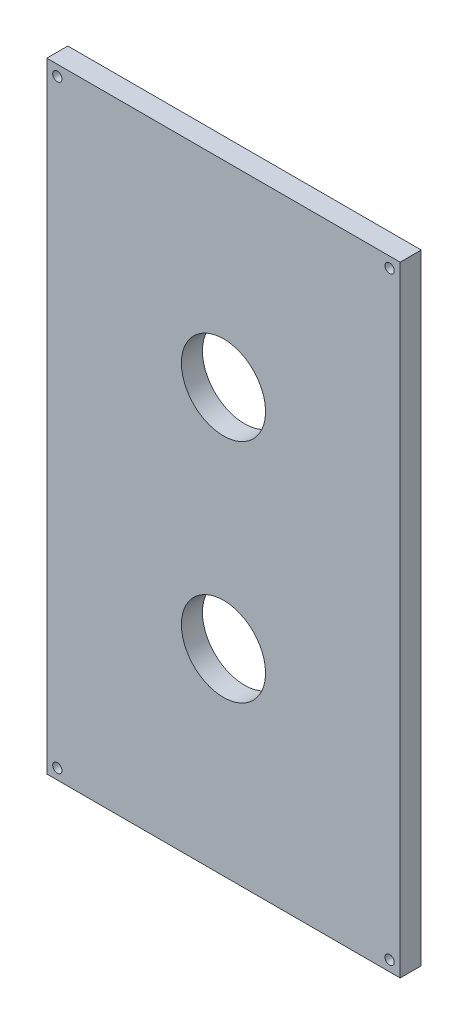
ISO-10303-21;
HEADER;
FILE_DESCRIPTION(('STEP AP214'),'2;1');
FILE_NAME('part.step','',(''),(''),'','','');
FILE_SCHEMA(('AUTOMOTIVE_DESIGN { 1 0 10303 214 1 1 1 1 }'));
ENDSEC;
DATA;
#1=APPLICATION_CONTEXT('core data for automotive mechanical design processes');
#2=APPLICATION_PROTOCOL_DEFINITION('international standard','automotive_design',2000,#1);
#3=PRODUCT_CONTEXT('',#1,'mechanical');
#4=PRODUCT('Part','Part','',(#3));
#5=PRODUCT_RELATED_PRODUCT_CATEGORY('part','',(#4));
#6=PRODUCT_DEFINITION_FORMATION('','',#4);
#7=PRODUCT_DEFINITION_CONTEXT('part definition',#1,'design');
#8=PRODUCT_DEFINITION('design','',#6,#7);
#9=PRODUCT_DEFINITION_SHAPE('','',#8);
#10=(LENGTH_UNIT() NAMED_UNIT(*) SI_UNIT(.MILLI.,.METRE.));
#11=(NAMED_UNIT(*) PLANE_ANGLE_UNIT() SI_UNIT($,.RADIAN.));
#12=(NAMED_UNIT(*) SI_UNIT($,.STERADIAN.) SOLID_ANGLE_UNIT());
#13=UNCERTAINTY_MEASURE_WITH_UNIT(LENGTH_MEASURE(1.E-05),#10,'distance_accuracy_value','');
#14=(GEOMETRIC_REPRESENTATION_CONTEXT(3) GLOBAL_UNCERTAINTY_ASSIGNED_CONTEXT((#13)) GLOBAL_UNIT_ASSIGNED_CONTEXT((#10,
#11,#12)) REPRESENTATION_CONTEXT('',''));
#15=CARTESIAN_POINT('',(0.,0.,0.));
#16=DIRECTION('',(0.,0.,1.));
#17=DIRECTION('',(1.,0.,0.));
#18=AXIS2_PLACEMENT_3D('',#15,#16,#17);
#19=CARTESIAN_POINT('',(0.,147.35,5.));
#20=DIRECTION('',(-1.,0.,0.));
#21=DIRECTION('',(0.,0.,1.));
#22=AXIS2_PLACEMENT_3D('',#19,#20,#21);
#23=PLANE('',#22);
#24=DIRECTION('',(0.,1.,0.));
#25=VECTOR('',#24,1.);
#26=CARTESIAN_POINT('',(0.,147.35,0.));
#27=LINE('',#26,#25);
#28=CARTESIAN_POINT('',(0.,0.,0.));
#29=VERTEX_POINT('',#28);
#30=CARTESIAN_POINT('',(0.,147.35,0.));
#31=VERTEX_POINT('',#30);
#32=EDGE_CURVE('E96',#29,#31,#27,.T.);
#33=ORIENTED_EDGE('',*,*,#32,.T.);
#34=DIRECTION('',(0.,0.,-1.));
#35=VECTOR('',#34,1.);
#36=CARTESIAN_POINT('',(0.,147.35,5.));
#37=LINE('',#36,#35);
#38=CARTESIAN_POINT('',(0.,147.35,5.));
#39=VERTEX_POINT('',#38);
#40=EDGE_CURVE('E11',#39,#31,#37,.T.);
#41=ORIENTED_EDGE('',*,*,#40,.F.);
#42=DIRECTION('',(0.,1.,0.));
#43=VECTOR('',#42,1.);
#44=CARTESIAN_POINT('',(0.,147.35,5.));
#45=LINE('',#44,#43);
#46=CARTESIAN_POINT('',(0.,0.,5.));
#47=VERTEX_POINT('',#46);
#48=EDGE_CURVE('E84',#47,#39,#45,.T.);
#49=ORIENTED_EDGE('',*,*,#48,.F.);
#50=DIRECTION('',(0.,0.,-1.));
#51=VECTOR('',#50,1.);
#52=CARTESIAN_POINT('',(0.,0.,5.));
#53=LINE('',#52,#51);
#54=EDGE_CURVE('E92',#47,#29,#53,.T.);
#55=ORIENTED_EDGE('',*,*,#54,.T.);
#56=EDGE_LOOP('',(#33,#41,#49,#55));
#57=FACE_BOUND('',#56,.T.);
#58=ADVANCED_FACE('F33',(#57),#23,.F.);
#59=CARTESIAN_POINT('',(-83.98,147.35,5.));
#60=DIRECTION('',(0.,-1.,0.));
#61=DIRECTION('',(0.,0.,-1.));
#62=AXIS2_PLACEMENT_3D('',#59,#60,#61);
#63=PLANE('',#62);
#64=DIRECTION('',(-1.,0.,0.));
#65=VECTOR('',#64,1.);
#66=CARTESIAN_POINT('',(-83.98,147.35,0.));
#67=LINE('',#66,#65);
#68=CARTESIAN_POINT('',(-83.98,147.35,0.));
#69=VERTEX_POINT('',#68);
#70=EDGE_CURVE('E88',#31,#69,#67,.T.);
#71=ORIENTED_EDGE('',*,*,#70,.T.);
#72=DIRECTION('',(0.,0.,-1.));
#73=VECTOR('',#72,1.);
#74=CARTESIAN_POINT('',(-83.98,147.35,5.));
#75=LINE('',#74,#73);
#76=CARTESIAN_POINT('',(-83.98,147.35,5.));
#77=VERTEX_POINT('',#76);
#78=EDGE_CURVE('E41',#77,#69,#75,.T.);
#79=ORIENTED_EDGE('',*,*,#78,.F.);
#80=DIRECTION('',(-1.,0.,0.));
#81=VECTOR('',#80,1.);
#82=CARTESIAN_POINT('',(-83.98,147.35,5.));
#83=LINE('',#82,#81);
#84=EDGE_CURVE('E79',#39,#77,#83,.T.);
#85=ORIENTED_EDGE('',*,*,#84,.F.);
#86=ORIENTED_EDGE('',*,*,#40,.T.);
#87=EDGE_LOOP('',(#71,#79,#85,#86));
#88=FACE_BOUND('',#87,.T.);
#89=ADVANCED_FACE('F87',(#88),#63,.F.);
#90=CARTESIAN_POINT('',(-83.98,0.,5.));
#91=DIRECTION('',(1.,0.,0.));
#92=DIRECTION('',(0.,0.,-1.));
#93=AXIS2_PLACEMENT_3D('',#90,#91,#92);
#94=PLANE('',#93);
#95=DIRECTION('',(0.,-1.,0.));
#96=VECTOR('',#95,1.);
#97=CARTESIAN_POINT('',(-83.98,0.,0.));
#98=LINE('',#97,#96);
#99=CARTESIAN_POINT('',(-83.98,0.,0.));
#100=VERTEX_POINT('',#99);
#101=EDGE_CURVE('E66',#69,#100,#98,.T.);
#102=ORIENTED_EDGE('',*,*,#101,.T.);
#103=DIRECTION('',(0.,0.,-1.));
#104=VECTOR('',#103,1.);
#105=CARTESIAN_POINT('',(-83.98,0.,5.));
#106=LINE('',#105,#104);
#107=CARTESIAN_POINT('',(-83.98,0.,5.));
#108=VERTEX_POINT('',#107);
#109=EDGE_CURVE('E89',#108,#100,#106,.T.);
#110=ORIENTED_EDGE('',*,*,#109,.F.);
#111=DIRECTION('',(0.,-1.,0.));
#112=VECTOR('',#111,1.);
#113=CARTESIAN_POINT('',(-83.98,0.,5.));
#114=LINE('',#113,#112);
#115=EDGE_CURVE('E82',#77,#108,#114,.T.);
#116=ORIENTED_EDGE('',*,*,#115,.F.);
#117=ORIENTED_EDGE('',*,*,#78,.T.);
#118=EDGE_LOOP('',(#102,#110,#116,#117));
#119=FACE_BOUND('',#118,.T.);
#120=ADVANCED_FACE('F90',(#119),#94,.F.);
#121=CARTESIAN_POINT('',(0.,0.,5.));
#122=DIRECTION('',(0.,1.,0.));
#123=DIRECTION('',(-1.,0.,0.));
#124=AXIS2_PLACEMENT_3D('',#121,#122,#123);
#125=PLANE('',#124);
#126=DIRECTION('',(1.,0.,0.));
#127=VECTOR('',#126,1.);
#128=CARTESIAN_POINT('',(0.,0.,0.));
#129=LINE('',#128,#127);
#130=EDGE_CURVE('E72',#100,#29,#129,.T.);
#131=ORIENTED_EDGE('',*,*,#130,.T.);
#132=ORIENTED_EDGE('',*,*,#54,.F.);
#133=DIRECTION('',(1.,0.,0.));
#134=VECTOR('',#133,1.);
#135=CARTESIAN_POINT('',(0.,0.,5.));
#136=LINE('',#135,#134);
#137=EDGE_CURVE('E49',#108,#47,#136,.T.);
#138=ORIENTED_EDGE('',*,*,#137,.F.);
#139=ORIENTED_EDGE('',*,*,#109,.T.);
#140=EDGE_LOOP('',(#131,#132,#138,#139));
#141=FACE_BOUND('',#140,.T.);
#142=ADVANCED_FACE('F104',(#141),#125,.F.);
#143=CARTESIAN_POINT('',(0.,0.,5.));
#144=DIRECTION('',(0.,0.,-1.));
#145=DIRECTION('',(-1.,0.,0.));
#146=AXIS2_PLACEMENT_3D('',#143,#144,#145);
#147=PLANE('',#146);
#148=CARTESIAN_POINT('',(-2.5,2.49999999999999,5.));
#149=DIRECTION('',(0.,0.,-1.));
#150=DIRECTION('',(-1.,0.,0.));
#151=AXIS2_PLACEMENT_3D('',#148,#149,#150);
#152=CIRCLE('',#151,1.1);
#153=CARTESIAN_POINT('',(-3.6,2.49999999999999,5.));
#154=VERTEX_POINT('',#153);
#155=EDGE_CURVE('E131',#154,#154,#152,.T.);
#156=ORIENTED_EDGE('',*,*,#155,.T.);
#157=EDGE_LOOP('',(#156));
#158=FACE_BOUND('',#157,.T.);
#159=CARTESIAN_POINT('',(-81.48,2.49999999999999,5.));
#160=DIRECTION('',(0.,0.,-1.));
#161=DIRECTION('',(-1.,0.,0.));
#162=AXIS2_PLACEMENT_3D('',#159,#160,#161);
#163=CIRCLE('',#162,1.10000000000001);
#164=CARTESIAN_POINT('',(-82.58,2.49999999999999,5.));
#165=VERTEX_POINT('',#164);
#166=EDGE_CURVE('E137',#165,#165,#163,.T.);
#167=ORIENTED_EDGE('',*,*,#166,.T.);
#168=EDGE_LOOP('',(#167));
#169=FACE_BOUND('',#168,.T.);
#170=CARTESIAN_POINT('',(-81.48,144.85,5.));
#171=DIRECTION('',(0.,0.,-1.));
#172=DIRECTION('',(-1.,0.,0.));
#173=AXIS2_PLACEMENT_3D('',#170,#171,#172);
#174=CIRCLE('',#173,1.1);
#175=CARTESIAN_POINT('',(-82.58,144.85,5.));
#176=VERTEX_POINT('',#175);
#177=EDGE_CURVE('E125',#176,#176,#174,.T.);
#178=ORIENTED_EDGE('',*,*,#177,.T.);
#179=EDGE_LOOP('',(#178));
#180=FACE_BOUND('',#179,.T.);
#181=CARTESIAN_POINT('',(-2.5,144.85,5.));
#182=DIRECTION('',(0.,0.,-1.));
#183=DIRECTION('',(-1.,0.,0.));
#184=AXIS2_PLACEMENT_3D('',#181,#182,#183);
#185=CIRCLE('',#184,1.09999999999999);
#186=CARTESIAN_POINT('',(-3.59999999999999,144.85,5.));
#187=VERTEX_POINT('',#186);
#188=EDGE_CURVE('E114',#187,#187,#185,.T.);
#189=ORIENTED_EDGE('',*,*,#188,.T.);
#190=EDGE_LOOP('',(#189));
#191=FACE_BOUND('',#190,.T.);
#192=CARTESIAN_POINT('',(-41.99,100.585,5.));
#193=DIRECTION('',(0.,0.,-1.));
#194=DIRECTION('',(-1.,0.,0.));
#195=AXIS2_PLACEMENT_3D('',#192,#193,#194);
#196=CIRCLE('',#195,10.);
#197=CARTESIAN_POINT('',(-51.99,100.585,5.));
#198=VERTEX_POINT('',#197);
#199=EDGE_CURVE('E99',#198,#198,#196,.T.);
#200=ORIENTED_EDGE('',*,*,#199,.T.);
#201=EDGE_LOOP('',(#200));
#202=FACE_BOUND('',#201,.T.);
#203=CARTESIAN_POINT('',(-41.99,46.765,5.));
#204=DIRECTION('',(0.,0.,-1.));
#205=DIRECTION('',(-1.,0.,0.));
#206=AXIS2_PLACEMENT_3D('',#203,#204,#205);
#207=CIRCLE('',#206,10.);
#208=CARTESIAN_POINT('',(-51.99,46.765,5.));
#209=VERTEX_POINT('',#208);
#210=EDGE_CURVE('E113',#209,#209,#207,.T.);
#211=ORIENTED_EDGE('',*,*,#210,.T.);
#212=EDGE_LOOP('',(#211));
#213=FACE_BOUND('',#212,.T.);
#214=ORIENTED_EDGE('',*,*,#48,.T.);
#215=ORIENTED_EDGE('',*,*,#84,.T.);
#216=ORIENTED_EDGE('',*,*,#115,.T.);
#217=ORIENTED_EDGE('',*,*,#137,.T.);
#218=EDGE_LOOP('',(#214,#215,#216,#217));
#219=FACE_BOUND('',#218,.T.);
#220=ADVANCED_FACE('F80',(#158,#169,#180,#191,#202,#213,#219),#147,.F.);
#221=CARTESIAN_POINT('',(0.,0.,0.));
#222=DIRECTION('',(0.,0.,-1.));
#223=DIRECTION('',(-1.,0.,0.));
#224=AXIS2_PLACEMENT_3D('',#221,#222,#223);
#225=PLANE('',#224);
#226=CARTESIAN_POINT('',(-2.5,2.49999999999999,0.));
#227=DIRECTION('',(0.,0.,-1.));
#228=DIRECTION('',(-1.,0.,0.));
#229=AXIS2_PLACEMENT_3D('',#226,#227,#228);
#230=CIRCLE('',#229,1.1);
#231=CARTESIAN_POINT('',(-3.6,2.49999999999999,0.));
#232=VERTEX_POINT('',#231);
#233=EDGE_CURVE('E128',#232,#232,#230,.T.);
#234=ORIENTED_EDGE('',*,*,#233,.F.);
#235=EDGE_LOOP('',(#234));
#236=FACE_BOUND('',#235,.T.);
#237=CARTESIAN_POINT('',(-81.48,2.49999999999999,0.));
#238=DIRECTION('',(0.,0.,-1.));
#239=DIRECTION('',(-1.,0.,0.));
#240=AXIS2_PLACEMENT_3D('',#237,#238,#239);
#241=CIRCLE('',#240,1.10000000000001);
#242=CARTESIAN_POINT('',(-82.58,2.49999999999999,0.));
#243=VERTEX_POINT('',#242);
#244=EDGE_CURVE('E134',#243,#243,#241,.T.);
#245=ORIENTED_EDGE('',*,*,#244,.F.);
#246=EDGE_LOOP('',(#245));
#247=FACE_BOUND('',#246,.T.);
#248=CARTESIAN_POINT('',(-81.48,144.85,0.));
#249=DIRECTION('',(0.,0.,-1.));
#250=DIRECTION('',(-1.,0.,0.));
#251=AXIS2_PLACEMENT_3D('',#248,#249,#250);
#252=CIRCLE('',#251,1.1);
#253=CARTESIAN_POINT('',(-82.58,144.85,0.));
#254=VERTEX_POINT('',#253);
#255=EDGE_CURVE('E140',#254,#254,#252,.T.);
#256=ORIENTED_EDGE('',*,*,#255,.F.);
#257=EDGE_LOOP('',(#256));
#258=FACE_BOUND('',#257,.T.);
#259=CARTESIAN_POINT('',(-2.5,144.85,0.));
#260=DIRECTION('',(0.,0.,-1.));
#261=DIRECTION('',(-1.,0.,0.));
#262=AXIS2_PLACEMENT_3D('',#259,#260,#261);
#263=CIRCLE('',#262,1.09999999999999);
#264=CARTESIAN_POINT('',(-3.59999999999999,144.85,0.));
#265=VERTEX_POINT('',#264);
#266=EDGE_CURVE('E122',#265,#265,#263,.T.);
#267=ORIENTED_EDGE('',*,*,#266,.F.);
#268=EDGE_LOOP('',(#267));
#269=FACE_BOUND('',#268,.T.);
#270=CARTESIAN_POINT('',(-41.99,100.585,0.));
#271=DIRECTION('',(0.,0.,-1.));
#272=DIRECTION('',(-1.,0.,0.));
#273=AXIS2_PLACEMENT_3D('',#270,#271,#272);
#274=CIRCLE('',#273,10.);
#275=CARTESIAN_POINT('',(-51.99,100.585,0.));
#276=VERTEX_POINT('',#275);
#277=EDGE_CURVE('E117',#276,#276,#274,.T.);
#278=ORIENTED_EDGE('',*,*,#277,.F.);
#279=EDGE_LOOP('',(#278));
#280=FACE_BOUND('',#279,.T.);
#281=CARTESIAN_POINT('',(-41.99,46.765,0.));
#282=DIRECTION('',(0.,0.,-1.));
#283=DIRECTION('',(-1.,0.,0.));
#284=AXIS2_PLACEMENT_3D('',#281,#282,#283);
#285=CIRCLE('',#284,10.);
#286=CARTESIAN_POINT('',(-51.99,46.765,0.));
#287=VERTEX_POINT('',#286);
#288=EDGE_CURVE('E110',#287,#287,#285,.T.);
#289=ORIENTED_EDGE('',*,*,#288,.F.);
#290=EDGE_LOOP('',(#289));
#291=FACE_BOUND('',#290,.T.);
#292=ORIENTED_EDGE('',*,*,#32,.F.);
#293=ORIENTED_EDGE('',*,*,#130,.F.);
#294=ORIENTED_EDGE('',*,*,#101,.F.);
#295=ORIENTED_EDGE('',*,*,#70,.F.);
#296=EDGE_LOOP('',(#292,#293,#294,#295));
#297=FACE_BOUND('',#296,.T.);
#298=ADVANCED_FACE('F107',(#236,#247,#258,#269,#280,#291,#297),#225,.T.);
#299=CARTESIAN_POINT('',(-41.99,46.765,5.));
#300=DIRECTION('',(0.,0.,-1.));
#301=DIRECTION('',(-1.,0.,0.));
#302=AXIS2_PLACEMENT_3D('',#299,#300,#301);
#303=CYLINDRICAL_SURFACE('',#302,10.);
#304=ORIENTED_EDGE('',*,*,#210,.F.);
#305=EDGE_LOOP('',(#304));
#306=FACE_BOUND('',#305,.T.);
#307=ORIENTED_EDGE('',*,*,#288,.T.);
#308=EDGE_LOOP('',(#307));
#309=FACE_BOUND('',#308,.T.);
#310=ADVANCED_FACE('F158',(#306,#309),#303,.F.);
#311=CARTESIAN_POINT('',(-41.99,100.585,5.));
#312=DIRECTION('',(0.,0.,-1.));
#313=DIRECTION('',(-1.,0.,0.));
#314=AXIS2_PLACEMENT_3D('',#311,#312,#313);
#315=CYLINDRICAL_SURFACE('',#314,10.);
#316=ORIENTED_EDGE('',*,*,#199,.F.);
#317=EDGE_LOOP('',(#316));
#318=FACE_BOUND('',#317,.T.);
#319=ORIENTED_EDGE('',*,*,#277,.T.);
#320=EDGE_LOOP('',(#319));
#321=FACE_BOUND('',#320,.T.);
#322=ADVANCED_FACE('F168',(#318,#321),#315,.F.);
#323=CARTESIAN_POINT('',(-2.5,144.85,5.));
#324=DIRECTION('',(0.,0.,-1.));
#325=DIRECTION('',(-1.,0.,0.));
#326=AXIS2_PLACEMENT_3D('',#323,#324,#325);
#327=CYLINDRICAL_SURFACE('',#326,1.09999999999999);
#328=ORIENTED_EDGE('',*,*,#188,.F.);
#329=EDGE_LOOP('',(#328));
#330=FACE_BOUND('',#329,.T.);
#331=ORIENTED_EDGE('',*,*,#266,.T.);
#332=EDGE_LOOP('',(#331));
#333=FACE_BOUND('',#332,.T.);
#334=ADVANCED_FACE('F152',(#330,#333),#327,.F.);
#335=CARTESIAN_POINT('',(-81.48,144.85,5.));
#336=DIRECTION('',(0.,0.,-1.));
#337=DIRECTION('',(-1.,0.,0.));
#338=AXIS2_PLACEMENT_3D('',#335,#336,#337);
#339=CYLINDRICAL_SURFACE('',#338,1.1);
#340=ORIENTED_EDGE('',*,*,#177,.F.);
#341=EDGE_LOOP('',(#340));
#342=FACE_BOUND('',#341,.T.);
#343=ORIENTED_EDGE('',*,*,#255,.T.);
#344=EDGE_LOOP('',(#343));
#345=FACE_BOUND('',#344,.T.);
#346=ADVANCED_FACE('F148',(#342,#345),#339,.F.);
#347=CARTESIAN_POINT('',(-81.48,2.49999999999999,5.));
#348=DIRECTION('',(0.,0.,-1.));
#349=DIRECTION('',(-1.,0.,0.));
#350=AXIS2_PLACEMENT_3D('',#347,#348,#349);
#351=CYLINDRICAL_SURFACE('',#350,1.10000000000001);
#352=ORIENTED_EDGE('',*,*,#166,.F.);
#353=EDGE_LOOP('',(#352));
#354=FACE_BOUND('',#353,.T.);
#355=ORIENTED_EDGE('',*,*,#244,.T.);
#356=EDGE_LOOP('',(#355));
#357=FACE_BOUND('',#356,.T.);
#358=ADVANCED_FACE('F151',(#354,#357),#351,.F.);
#359=CARTESIAN_POINT('',(-2.5,2.49999999999999,5.));
#360=DIRECTION('',(0.,0.,-1.));
#361=DIRECTION('',(-1.,0.,0.));
#362=AXIS2_PLACEMENT_3D('',#359,#360,#361);
#363=CYLINDRICAL_SURFACE('',#362,1.1);
#364=ORIENTED_EDGE('',*,*,#155,.F.);
#365=EDGE_LOOP('',(#364));
#366=FACE_BOUND('',#365,.T.);
#367=ORIENTED_EDGE('',*,*,#233,.T.);
#368=EDGE_LOOP('',(#367));
#369=FACE_BOUND('',#368,.T.);
#370=ADVANCED_FACE('F198',(#366,#369),#363,.F.);
#371=CLOSED_SHELL('',(#58,#89,#120,#142,#220,#298,#310,#322,#334,#346,#358,#370));
#372=MANIFOLD_SOLID_BREP('B2',#371);
#373=ADVANCED_BREP_SHAPE_REPRESENTATION('',(#18,#372),#14);
#374=SHAPE_DEFINITION_REPRESENTATION(#9,#373);
ENDSEC;
END-ISO-10303-21;
